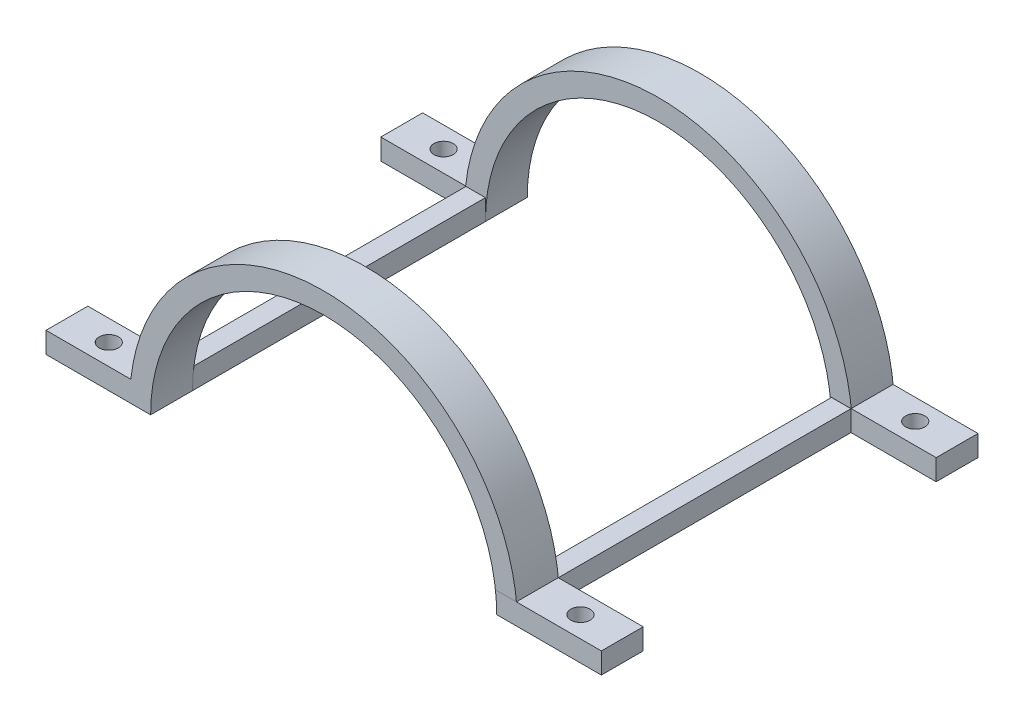
ISO-10303-21;
HEADER;
FILE_DESCRIPTION(('STEP AP214'),'2;1');
FILE_NAME('part.step','',(''),(''),'','','');
FILE_SCHEMA(('AUTOMOTIVE_DESIGN { 1 0 10303 214 1 1 1 1 }'));
ENDSEC;
DATA;
#1=APPLICATION_CONTEXT('core data for automotive mechanical design processes');
#2=APPLICATION_PROTOCOL_DEFINITION('international standard','automotive_design',2000,#1);
#3=PRODUCT_CONTEXT('',#1,'mechanical');
#4=PRODUCT('Part','Part','',(#3));
#5=PRODUCT_RELATED_PRODUCT_CATEGORY('part','',(#4));
#6=PRODUCT_DEFINITION_FORMATION('','',#4);
#7=PRODUCT_DEFINITION_CONTEXT('part definition',#1,'design');
#8=PRODUCT_DEFINITION('design','',#6,#7);
#9=PRODUCT_DEFINITION_SHAPE('','',#8);
#10=(LENGTH_UNIT() NAMED_UNIT(*) SI_UNIT(.MILLI.,.METRE.));
#11=(NAMED_UNIT(*) PLANE_ANGLE_UNIT() SI_UNIT($,.RADIAN.));
#12=(NAMED_UNIT(*) SI_UNIT($,.STERADIAN.) SOLID_ANGLE_UNIT());
#13=UNCERTAINTY_MEASURE_WITH_UNIT(LENGTH_MEASURE(1.E-05),#10,'distance_accuracy_value','');
#14=(GEOMETRIC_REPRESENTATION_CONTEXT(3) GLOBAL_UNCERTAINTY_ASSIGNED_CONTEXT((#13)) GLOBAL_UNIT_ASSIGNED_CONTEXT((#10,
#11,#12)) REPRESENTATION_CONTEXT('',''));
#15=CARTESIAN_POINT('',(0.,0.,0.));
#16=DIRECTION('',(0.,0.,1.));
#17=DIRECTION('',(1.,0.,0.));
#18=AXIS2_PLACEMENT_3D('',#15,#16,#17);
#19=CARTESIAN_POINT('',(66.35,0.,80.));
#20=DIRECTION('',(-1.,0.,0.));
#21=DIRECTION('',(0.,0.,1.));
#22=AXIS2_PLACEMENT_3D('',#19,#20,#21);
#23=PLANE('',#22);
#24=DIRECTION('',(0.,-1.,0.));
#25=VECTOR('',#24,1.);
#26=CARTESIAN_POINT('',(66.35,0.,90.));
#27=LINE('',#26,#25);
#28=CARTESIAN_POINT('',(66.35,5.,90.));
#29=VERTEX_POINT('',#28);
#30=CARTESIAN_POINT('',(66.35,0.,90.));
#31=VERTEX_POINT('',#30);
#32=EDGE_CURVE('E125',#29,#31,#27,.T.);
#33=ORIENTED_EDGE('',*,*,#32,.T.);
#34=DIRECTION('',(0.,0.,-1.));
#35=VECTOR('',#34,1.);
#36=CARTESIAN_POINT('',(66.35,0.,90.));
#37=LINE('',#36,#35);
#38=CARTESIAN_POINT('',(66.35,0.,80.));
#39=VERTEX_POINT('',#38);
#40=EDGE_CURVE('E116',#31,#39,#37,.T.);
#41=ORIENTED_EDGE('',*,*,#40,.T.);
#42=DIRECTION('',(0.,1.,0.));
#43=VECTOR('',#42,1.);
#44=CARTESIAN_POINT('',(66.35,0.,80.));
#45=LINE('',#44,#43);
#46=CARTESIAN_POINT('',(66.35,5.,80.));
#47=VERTEX_POINT('',#46);
#48=EDGE_CURVE('E129',#39,#47,#45,.T.);
#49=ORIENTED_EDGE('',*,*,#48,.T.);
#50=DIRECTION('',(0.,0.,1.));
#51=VECTOR('',#50,1.);
#52=CARTESIAN_POINT('',(66.35,5.,90.));
#53=LINE('',#52,#51);
#54=EDGE_CURVE('E78',#47,#29,#53,.T.);
#55=ORIENTED_EDGE('',*,*,#54,.T.);
#56=EDGE_LOOP('',(#33,#41,#49,#55));
#57=FACE_BOUND('',#56,.T.);
#58=ADVANCED_FACE('F53',(#57),#23,.F.);
#59=CARTESIAN_POINT('',(66.35,5.,90.));
#60=DIRECTION('',(0.,-1.,0.));
#61=DIRECTION('',(0.,0.,-1.));
#62=AXIS2_PLACEMENT_3D('',#59,#60,#61);
#63=PLANE('',#62);
#64=CARTESIAN_POINT('',(56.35,5.,85.));
#65=DIRECTION('',(0.,-1.,0.));
#66=DIRECTION('',(0.,0.,-1.));
#67=AXIS2_PLACEMENT_3D('',#64,#65,#66);
#68=CIRCLE('',#67,2.3);
#69=CARTESIAN_POINT('',(56.35,5.,82.7));
#70=VERTEX_POINT('',#69);
#71=EDGE_CURVE('E147',#70,#70,#68,.T.);
#72=ORIENTED_EDGE('',*,*,#71,.T.);
#73=EDGE_LOOP('',(#72));
#74=FACE_BOUND('',#73,.T.);
#75=DIRECTION('',(0.,0.,-1.));
#76=VECTOR('',#75,1.);
#77=CARTESIAN_POINT('',(41.0465893832849,5.,130.));
#78=LINE('',#77,#76);
#79=CARTESIAN_POINT('',(41.0465893832849,5.,90.));
#80=VERTEX_POINT('',#79);
#81=CARTESIAN_POINT('',(41.0465893832849,5.,80.));
#82=VERTEX_POINT('',#81);
#83=EDGE_CURVE('E12',#80,#82,#78,.T.);
#84=ORIENTED_EDGE('',*,*,#83,.F.);
#85=DIRECTION('',(-1.,0.,0.));
#86=VECTOR('',#85,1.);
#87=CARTESIAN_POINT('',(66.35,5.,90.));
#88=LINE('',#87,#86);
#89=EDGE_CURVE('E112',#29,#80,#88,.T.);
#90=ORIENTED_EDGE('',*,*,#89,.F.);
#91=ORIENTED_EDGE('',*,*,#54,.F.);
#92=DIRECTION('',(-1.,0.,0.));
#93=VECTOR('',#92,1.);
#94=CARTESIAN_POINT('',(66.35,5.,80.));
#95=LINE('',#94,#93);
#96=EDGE_CURVE('E102',#47,#82,#95,.T.);
#97=ORIENTED_EDGE('',*,*,#96,.T.);
#98=EDGE_LOOP('',(#84,#90,#91,#97));
#99=FACE_BOUND('',#98,.T.);
#100=ADVANCED_FACE('F109',(#74,#99),#63,.F.);
#101=CARTESIAN_POINT('',(66.35,0.,80.));
#102=DIRECTION('',(0.,0.,1.));
#103=DIRECTION('',(1.,0.,0.));
#104=AXIS2_PLACEMENT_3D('',#101,#102,#103);
#105=PLANE('',#104);
#106=CARTESIAN_POINT('',(0.,0.,80.));
#107=DIRECTION('',(0.,0.,1.));
#108=DIRECTION('',(1.,0.,0.));
#109=AXIS2_PLACEMENT_3D('',#106,#107,#108);
#110=CIRCLE('',#109,41.35);
#111=CARTESIAN_POINT('',(41.35,0.,80.));
#112=VERTEX_POINT('',#111);
#113=EDGE_CURVE('E94',#82,#112,#110,.F.);
#114=ORIENTED_EDGE('',*,*,#113,.F.);
#115=ORIENTED_EDGE('',*,*,#96,.F.);
#116=ORIENTED_EDGE('',*,*,#48,.F.);
#117=DIRECTION('',(-1.,0.,0.));
#118=VECTOR('',#117,1.);
#119=CARTESIAN_POINT('',(66.35,0.,80.));
#120=LINE('',#119,#118);
#121=EDGE_CURVE('E106',#39,#112,#120,.T.);
#122=ORIENTED_EDGE('',*,*,#121,.T.);
#123=EDGE_LOOP('',(#114,#115,#116,#122));
#124=FACE_BOUND('',#123,.T.);
#125=ADVANCED_FACE('F105',(#124),#105,.F.);
#126=CARTESIAN_POINT('',(66.35,0.,90.));
#127=DIRECTION('',(0.,1.,0.));
#128=DIRECTION('',(0.,0.,1.));
#129=AXIS2_PLACEMENT_3D('',#126,#127,#128);
#130=PLANE('',#129);
#131=CARTESIAN_POINT('',(56.35,0.,85.));
#132=DIRECTION('',(0.,-1.,0.));
#133=DIRECTION('',(0.,0.,-1.));
#134=AXIS2_PLACEMENT_3D('',#131,#132,#133);
#135=CIRCLE('',#134,2.3);
#136=CARTESIAN_POINT('',(56.35,0.,82.7));
#137=VERTEX_POINT('',#136);
#138=EDGE_CURVE('E107',#137,#137,#135,.T.);
#139=ORIENTED_EDGE('',*,*,#138,.F.);
#140=EDGE_LOOP('',(#139));
#141=FACE_BOUND('',#140,.T.);
#142=DIRECTION('',(0.,0.,-1.));
#143=VECTOR('',#142,1.);
#144=CARTESIAN_POINT('',(41.35,0.,130.));
#145=LINE('',#144,#143);
#146=CARTESIAN_POINT('',(41.35,0.,90.));
#147=VERTEX_POINT('',#146);
#148=EDGE_CURVE('E110',#112,#147,#145,.F.);
#149=ORIENTED_EDGE('',*,*,#148,.F.);
#150=ORIENTED_EDGE('',*,*,#121,.F.);
#151=ORIENTED_EDGE('',*,*,#40,.F.);
#152=DIRECTION('',(-1.,0.,0.));
#153=VECTOR('',#152,1.);
#154=CARTESIAN_POINT('',(66.35,0.,90.));
#155=LINE('',#154,#153);
#156=EDGE_CURVE('E64',#31,#147,#155,.T.);
#157=ORIENTED_EDGE('',*,*,#156,.T.);
#158=EDGE_LOOP('',(#149,#150,#151,#157));
#159=FACE_BOUND('',#158,.T.);
#160=ADVANCED_FACE('F120',(#141,#159),#130,.F.);
#161=CARTESIAN_POINT('',(66.35,0.,90.));
#162=DIRECTION('',(0.,0.,-1.));
#163=DIRECTION('',(-1.,0.,0.));
#164=AXIS2_PLACEMENT_3D('',#161,#162,#163);
#165=PLANE('',#164);
#166=CARTESIAN_POINT('',(0.,0.,90.));
#167=DIRECTION('',(0.,0.,-1.));
#168=DIRECTION('',(-1.,0.,0.));
#169=AXIS2_PLACEMENT_3D('',#166,#167,#168);
#170=CIRCLE('',#169,41.35);
#171=EDGE_CURVE('E70',#147,#80,#170,.F.);
#172=ORIENTED_EDGE('',*,*,#171,.F.);
#173=ORIENTED_EDGE('',*,*,#156,.F.);
#174=ORIENTED_EDGE('',*,*,#32,.F.);
#175=ORIENTED_EDGE('',*,*,#89,.T.);
#176=EDGE_LOOP('',(#172,#173,#174,#175));
#177=FACE_BOUND('',#176,.T.);
#178=ADVANCED_FACE('F57',(#177),#165,.F.);
#179=CARTESIAN_POINT('',(0.,0.,130.));
#180=DIRECTION('',(0.,0.,-1.));
#181=DIRECTION('',(-1.,0.,0.));
#182=AXIS2_PLACEMENT_3D('',#179,#180,#181);
#183=CYLINDRICAL_SURFACE('',#182,41.35);
#184=ORIENTED_EDGE('',*,*,#171,.T.);
#185=ORIENTED_EDGE('',*,*,#83,.T.);
#186=ORIENTED_EDGE('',*,*,#113,.T.);
#187=ORIENTED_EDGE('',*,*,#148,.T.);
#188=EDGE_LOOP('',(#184,#185,#186,#187));
#189=FACE_BOUND('',#188,.T.);
#190=ADVANCED_FACE('F91',(#189),#183,.F.);
#191=CARTESIAN_POINT('',(56.35,-127.7,85.));
#192=DIRECTION('',(0.,1.,0.));
#193=DIRECTION('',(0.,0.,-1.));
#194=AXIS2_PLACEMENT_3D('',#191,#192,#193);
#195=CYLINDRICAL_SURFACE('',#194,2.3);
#196=ORIENTED_EDGE('',*,*,#71,.F.);
#197=EDGE_LOOP('',(#196));
#198=FACE_BOUND('',#197,.T.);
#199=ORIENTED_EDGE('',*,*,#138,.T.);
#200=EDGE_LOOP('',(#199));
#201=FACE_BOUND('',#200,.T.);
#202=ADVANCED_FACE('F156',(#198,#201),#195,.F.);
#203=CLOSED_SHELL('',(#58,#100,#125,#160,#178,#190,#202));
#204=MANIFOLD_SOLID_BREP('B2',#203);
#205=CARTESIAN_POINT('',(66.35,0.,0.));
#206=DIRECTION('',(-1.,0.,0.));
#207=DIRECTION('',(0.,0.,1.));
#208=AXIS2_PLACEMENT_3D('',#205,#206,#207);
#209=PLANE('',#208);
#210=DIRECTION('',(0.,-1.,0.));
#211=VECTOR('',#210,1.);
#212=CARTESIAN_POINT('',(66.35,0.,10.));
#213=LINE('',#212,#211);
#214=CARTESIAN_POINT('',(66.35,5.,10.));
#215=VERTEX_POINT('',#214);
#216=CARTESIAN_POINT('',(66.35,0.,10.));
#217=VERTEX_POINT('',#216);
#218=EDGE_CURVE('E277',#215,#217,#213,.T.);
#219=ORIENTED_EDGE('',*,*,#218,.T.);
#220=DIRECTION('',(0.,0.,-1.));
#221=VECTOR('',#220,1.);
#222=CARTESIAN_POINT('',(66.35,0.,10.));
#223=LINE('',#222,#221);
#224=CARTESIAN_POINT('',(66.35,0.,0.));
#225=VERTEX_POINT('',#224);
#226=EDGE_CURVE('E272',#217,#225,#223,.T.);
#227=ORIENTED_EDGE('',*,*,#226,.T.);
#228=DIRECTION('',(0.,1.,0.));
#229=VECTOR('',#228,1.);
#230=CARTESIAN_POINT('',(66.35,0.,0.));
#231=LINE('',#230,#229);
#232=CARTESIAN_POINT('',(66.35,5.,0.));
#233=VERTEX_POINT('',#232);
#234=EDGE_CURVE('E290',#225,#233,#231,.T.);
#235=ORIENTED_EDGE('',*,*,#234,.T.);
#236=DIRECTION('',(0.,0.,1.));
#237=VECTOR('',#236,1.);
#238=CARTESIAN_POINT('',(66.35,5.,10.));
#239=LINE('',#238,#237);
#240=EDGE_CURVE('E226',#233,#215,#239,.T.);
#241=ORIENTED_EDGE('',*,*,#240,.T.);
#242=EDGE_LOOP('',(#219,#227,#235,#241));
#243=FACE_BOUND('',#242,.T.);
#244=ADVANCED_FACE('F208',(#243),#209,.F.);
#245=CARTESIAN_POINT('',(56.35,-127.7,5.));
#246=DIRECTION('',(0.,1.,0.));
#247=DIRECTION('',(0.,0.,1.));
#248=AXIS2_PLACEMENT_3D('',#245,#246,#247);
#249=CYLINDRICAL_SURFACE('',#248,2.3);
#250=CARTESIAN_POINT('',(56.35,5.,5.));
#251=DIRECTION('',(0.,1.,0.));
#252=DIRECTION('',(0.,0.,1.));
#253=AXIS2_PLACEMENT_3D('',#250,#251,#252);
#254=CIRCLE('',#253,2.3);
#255=CARTESIAN_POINT('',(56.35,5.,7.3));
#256=VERTEX_POINT('',#255);
#257=EDGE_CURVE('E280',#256,#256,#254,.T.);
#258=ORIENTED_EDGE('',*,*,#257,.T.);
#259=EDGE_LOOP('',(#258));
#260=FACE_BOUND('',#259,.T.);
#261=CARTESIAN_POINT('',(56.35,0.,5.));
#262=DIRECTION('',(0.,1.,0.));
#263=DIRECTION('',(0.,0.,1.));
#264=AXIS2_PLACEMENT_3D('',#261,#262,#263);
#265=CIRCLE('',#264,2.3);
#266=CARTESIAN_POINT('',(56.35,0.,7.3));
#267=VERTEX_POINT('',#266);
#268=EDGE_CURVE('E278',#267,#267,#265,.T.);
#269=ORIENTED_EDGE('',*,*,#268,.F.);
#270=EDGE_LOOP('',(#269));
#271=FACE_BOUND('',#270,.T.);
#272=ADVANCED_FACE('F288',(#260,#271),#249,.F.);
#273=CARTESIAN_POINT('',(66.35,5.,10.));
#274=DIRECTION('',(0.,-1.,0.));
#275=DIRECTION('',(0.,0.,-1.));
#276=AXIS2_PLACEMENT_3D('',#273,#274,#275);
#277=PLANE('',#276);
#278=ORIENTED_EDGE('',*,*,#257,.F.);
#279=EDGE_LOOP('',(#278));
#280=FACE_BOUND('',#279,.T.);
#281=DIRECTION('',(0.,0.,-1.));
#282=VECTOR('',#281,1.);
#283=CARTESIAN_POINT('',(41.0465893832849,5.,50.));
#284=LINE('',#283,#282);
#285=CARTESIAN_POINT('',(41.0465893832849,5.,10.));
#286=VERTEX_POINT('',#285);
#287=CARTESIAN_POINT('',(41.0465893832849,5.,0.));
#288=VERTEX_POINT('',#287);
#289=EDGE_CURVE('E55',#286,#288,#284,.T.);
#290=ORIENTED_EDGE('',*,*,#289,.F.);
#291=DIRECTION('',(-1.,0.,0.));
#292=VECTOR('',#291,1.);
#293=CARTESIAN_POINT('',(66.35,5.,10.));
#294=LINE('',#293,#292);
#295=EDGE_CURVE('E262',#215,#286,#294,.T.);
#296=ORIENTED_EDGE('',*,*,#295,.F.);
#297=ORIENTED_EDGE('',*,*,#240,.F.);
#298=DIRECTION('',(-1.,0.,0.));
#299=VECTOR('',#298,1.);
#300=CARTESIAN_POINT('',(66.35,5.,0.));
#301=LINE('',#300,#299);
#302=EDGE_CURVE('E256',#233,#288,#301,.T.);
#303=ORIENTED_EDGE('',*,*,#302,.T.);
#304=EDGE_LOOP('',(#290,#296,#297,#303));
#305=FACE_BOUND('',#304,.T.);
#306=ADVANCED_FACE('F263',(#280,#305),#277,.F.);
#307=CARTESIAN_POINT('',(66.35,0.,0.));
#308=DIRECTION('',(0.,0.,1.));
#309=DIRECTION('',(1.,0.,0.));
#310=AXIS2_PLACEMENT_3D('',#307,#308,#309);
#311=PLANE('',#310);
#312=CARTESIAN_POINT('',(0.,0.,0.));
#313=DIRECTION('',(0.,0.,1.));
#314=DIRECTION('',(1.,0.,0.));
#315=AXIS2_PLACEMENT_3D('',#312,#313,#314);
#316=CIRCLE('',#315,41.35);
#317=CARTESIAN_POINT('',(41.35,0.,0.));
#318=VERTEX_POINT('',#317);
#319=EDGE_CURVE('E250',#288,#318,#316,.F.);
#320=ORIENTED_EDGE('',*,*,#319,.F.);
#321=ORIENTED_EDGE('',*,*,#302,.F.);
#322=ORIENTED_EDGE('',*,*,#234,.F.);
#323=DIRECTION('',(-1.,0.,0.));
#324=VECTOR('',#323,1.);
#325=CARTESIAN_POINT('',(66.35,0.,0.));
#326=LINE('',#325,#324);
#327=EDGE_CURVE('E257',#225,#318,#326,.T.);
#328=ORIENTED_EDGE('',*,*,#327,.T.);
#329=EDGE_LOOP('',(#320,#321,#322,#328));
#330=FACE_BOUND('',#329,.T.);
#331=ADVANCED_FACE('F258',(#330),#311,.F.);
#332=CARTESIAN_POINT('',(66.35,0.,10.));
#333=DIRECTION('',(0.,1.,0.));
#334=DIRECTION('',(0.,0.,1.));
#335=AXIS2_PLACEMENT_3D('',#332,#333,#334);
#336=PLANE('',#335);
#337=ORIENTED_EDGE('',*,*,#268,.T.);
#338=EDGE_LOOP('',(#337));
#339=FACE_BOUND('',#338,.T.);
#340=DIRECTION('',(0.,0.,-1.));
#341=VECTOR('',#340,1.);
#342=CARTESIAN_POINT('',(41.35,0.,50.));
#343=LINE('',#342,#341);
#344=CARTESIAN_POINT('',(41.35,0.,9.99999999999999));
#345=VERTEX_POINT('',#344);
#346=EDGE_CURVE('E261',#318,#345,#343,.F.);
#347=ORIENTED_EDGE('',*,*,#346,.F.);
#348=ORIENTED_EDGE('',*,*,#327,.F.);
#349=ORIENTED_EDGE('',*,*,#226,.F.);
#350=DIRECTION('',(-1.,0.,0.));
#351=VECTOR('',#350,1.);
#352=CARTESIAN_POINT('',(66.35,0.,10.));
#353=LINE('',#352,#351);
#354=EDGE_CURVE('E216',#217,#345,#353,.T.);
#355=ORIENTED_EDGE('',*,*,#354,.T.);
#356=EDGE_LOOP('',(#347,#348,#349,#355));
#357=FACE_BOUND('',#356,.T.);
#358=ADVANCED_FACE('F275',(#339,#357),#336,.F.);
#359=CARTESIAN_POINT('',(66.35,0.,10.));
#360=DIRECTION('',(0.,0.,-1.));
#361=DIRECTION('',(-1.,0.,0.));
#362=AXIS2_PLACEMENT_3D('',#359,#360,#361);
#363=PLANE('',#362);
#364=CARTESIAN_POINT('',(0.,0.,10.));
#365=DIRECTION('',(0.,0.,-1.));
#366=DIRECTION('',(-1.,0.,0.));
#367=AXIS2_PLACEMENT_3D('',#364,#365,#366);
#368=CIRCLE('',#367,41.35);
#369=EDGE_CURVE('E225',#345,#286,#368,.F.);
#370=ORIENTED_EDGE('',*,*,#369,.F.);
#371=ORIENTED_EDGE('',*,*,#354,.F.);
#372=ORIENTED_EDGE('',*,*,#218,.F.);
#373=ORIENTED_EDGE('',*,*,#295,.T.);
#374=EDGE_LOOP('',(#370,#371,#372,#373));
#375=FACE_BOUND('',#374,.T.);
#376=ADVANCED_FACE('F209',(#375),#363,.F.);
#377=CARTESIAN_POINT('',(0.,0.,50.));
#378=DIRECTION('',(0.,0.,-1.));
#379=DIRECTION('',(-1.,0.,0.));
#380=AXIS2_PLACEMENT_3D('',#377,#378,#379);
#381=CYLINDRICAL_SURFACE('',#380,41.35);
#382=ORIENTED_EDGE('',*,*,#369,.T.);
#383=ORIENTED_EDGE('',*,*,#289,.T.);
#384=ORIENTED_EDGE('',*,*,#319,.T.);
#385=ORIENTED_EDGE('',*,*,#346,.T.);
#386=EDGE_LOOP('',(#382,#383,#384,#385));
#387=FACE_BOUND('',#386,.T.);
#388=ADVANCED_FACE('F249',(#387),#381,.F.);
#389=CLOSED_SHELL('',(#244,#272,#306,#331,#358,#376,#388));
#390=MANIFOLD_SOLID_BREP('B6',#389);
#391=CARTESIAN_POINT('',(0.,0.,90.));
#392=DIRECTION('',(0.,0.,-1.));
#393=DIRECTION('',(-1.,0.,0.));
#394=AXIS2_PLACEMENT_3D('',#391,#392,#393);
#395=CYLINDRICAL_SURFACE('',#394,46.35);
#396=DIRECTION('',(0.,0.,-1.));
#397=VECTOR('',#396,1.);
#398=CARTESIAN_POINT('',(-46.0795236520518,5.,90.));
#399=LINE('',#398,#397);
#400=CARTESIAN_POINT('',(-46.0795236520518,5.,90.));
#401=VERTEX_POINT('',#400);
#402=CARTESIAN_POINT('',(-46.0795236520518,5.,80.));
#403=VERTEX_POINT('',#402);
#404=EDGE_CURVE('E515',#401,#403,#399,.T.);
#405=ORIENTED_EDGE('',*,*,#404,.F.);
#406=CARTESIAN_POINT('',(0.,0.,90.));
#407=DIRECTION('',(0.,0.,1.));
#408=DIRECTION('',(1.,0.,0.));
#409=AXIS2_PLACEMENT_3D('',#406,#407,#408);
#410=CIRCLE('',#409,46.35);
#411=CARTESIAN_POINT('',(46.35,0.,90.));
#412=VERTEX_POINT('',#411);
#413=EDGE_CURVE('E649',#412,#401,#410,.T.);
#414=ORIENTED_EDGE('',*,*,#413,.F.);
#415=DIRECTION('',(0.,0.,-1.));
#416=VECTOR('',#415,1.);
#417=CARTESIAN_POINT('',(46.35,0.,90.));
#418=LINE('',#417,#416);
#419=CARTESIAN_POINT('',(46.35,0.,80.));
#420=VERTEX_POINT('',#419);
#421=EDGE_CURVE('E488',#412,#420,#418,.T.);
#422=ORIENTED_EDGE('',*,*,#421,.T.);
#423=CARTESIAN_POINT('',(0.,0.,80.));
#424=DIRECTION('',(0.,0.,1.));
#425=DIRECTION('',(1.,0.,0.));
#426=AXIS2_PLACEMENT_3D('',#423,#424,#425);
#427=CIRCLE('',#426,46.35);
#428=EDGE_CURVE('E514',#420,#403,#427,.T.);
#429=ORIENTED_EDGE('',*,*,#428,.T.);
#430=EDGE_LOOP('',(#405,#414,#422,#429));
#431=FACE_BOUND('',#430,.T.);
#432=ADVANCED_FACE('F352',(#431),#395,.T.);
#433=CARTESIAN_POINT('',(-45.9984208708414,4.94728132986487,85.));
#434=DIRECTION('',(1.,0.,0.));
#435=DIRECTION('',(0.,0.,-1.));
#436=AXIS2_PLACEMENT_3D('',#433,#434,#435);
#437=PLANE('',#436);
#438=DIRECTION('',(0.,-1.,0.));
#439=VECTOR('',#438,1.);
#440=CARTESIAN_POINT('',(-45.9984208708414,4.94728132986487,80.));
#441=LINE('',#440,#439);
#442=CARTESIAN_POINT('',(-45.9984208708414,4.94728132986487,80.));
#443=VERTEX_POINT('',#442);
#444=CARTESIAN_POINT('',(-45.9984208708414,-2.88745506722327E-13,80.));
#445=VERTEX_POINT('',#444);
#446=EDGE_CURVE('E533',#443,#445,#441,.T.);
#447=ORIENTED_EDGE('',*,*,#446,.F.);
#448=DIRECTION('',(0.,0.,-1.));
#449=VECTOR('',#448,1.);
#450=CARTESIAN_POINT('',(-45.9984208708414,4.94728132986487,85.));
#451=LINE('',#450,#449);
#452=CARTESIAN_POINT('',(-45.9984208708414,4.94728132986487,9.99999999999999));
#453=VERTEX_POINT('',#452);
#454=EDGE_CURVE('E557',#443,#453,#451,.T.);
#455=ORIENTED_EDGE('',*,*,#454,.T.);
#456=DIRECTION('',(0.,1.,0.));
#457=VECTOR('',#456,1.);
#458=CARTESIAN_POINT('',(-45.9984208708414,0.,10.));
#459=LINE('',#458,#457);
#460=CARTESIAN_POINT('',(-45.9984208708414,-2.88745506722327E-13,9.99999999999999));
#461=VERTEX_POINT('',#460);
#462=EDGE_CURVE('E599',#461,#453,#459,.T.);
#463=ORIENTED_EDGE('',*,*,#462,.F.);
#464=DIRECTION('',(0.,0.,-1.));
#465=VECTOR('',#464,1.);
#466=CARTESIAN_POINT('',(-45.9984208708414,-2.88745506722327E-13,85.));
#467=LINE('',#466,#465);
#468=EDGE_CURVE('E561',#445,#461,#467,.T.);
#469=ORIENTED_EDGE('',*,*,#468,.F.);
#470=EDGE_LOOP('',(#447,#455,#463,#469));
#471=FACE_BOUND('',#470,.T.);
#472=ADVANCED_FACE('F617',(#471),#437,.F.);
#473=CARTESIAN_POINT('',(-41.35,4.94728132986487,85.));
#474=DIRECTION('',(-1.,0.,0.));
#475=DIRECTION('',(0.,0.,1.));
#476=AXIS2_PLACEMENT_3D('',#473,#474,#475);
#477=PLANE('',#476);
#478=DIRECTION('',(0.,1.,0.));
#479=VECTOR('',#478,1.);
#480=CARTESIAN_POINT('',(-41.35,4.94728132986487,80.));
#481=LINE('',#480,#479);
#482=CARTESIAN_POINT('',(-41.35,-2.88745506722327E-13,80.));
#483=VERTEX_POINT('',#482);
#484=CARTESIAN_POINT('',(-41.35,4.94728132986487,80.));
#485=VERTEX_POINT('',#484);
#486=EDGE_CURVE('E490',#483,#485,#481,.T.);
#487=ORIENTED_EDGE('',*,*,#486,.F.);
#488=DIRECTION('',(0.,0.,-1.));
#489=VECTOR('',#488,1.);
#490=CARTESIAN_POINT('',(-41.35,-2.88745506722327E-13,85.));
#491=LINE('',#490,#489);
#492=CARTESIAN_POINT('',(-41.35,-2.88745506722327E-13,9.99999999999999));
#493=VERTEX_POINT('',#492);
#494=EDGE_CURVE('E564',#483,#493,#491,.T.);
#495=ORIENTED_EDGE('',*,*,#494,.T.);
#496=DIRECTION('',(0.,-1.,0.));
#497=VECTOR('',#496,1.);
#498=CARTESIAN_POINT('',(-41.35,0.,10.));
#499=LINE('',#498,#497);
#500=CARTESIAN_POINT('',(-41.35,4.94728132986487,10.));
#501=VERTEX_POINT('',#500);
#502=EDGE_CURVE('E600',#501,#493,#499,.T.);
#503=ORIENTED_EDGE('',*,*,#502,.F.);
#504=DIRECTION('',(0.,0.,-1.));
#505=VECTOR('',#504,1.);
#506=CARTESIAN_POINT('',(-41.35,4.94728132986487,85.));
#507=LINE('',#506,#505);
#508=EDGE_CURVE('E556',#485,#501,#507,.T.);
#509=ORIENTED_EDGE('',*,*,#508,.F.);
#510=EDGE_LOOP('',(#487,#495,#503,#509));
#511=FACE_BOUND('',#510,.T.);
#512=ADVANCED_FACE('F608',(#511),#477,.F.);
#513=CARTESIAN_POINT('',(-45.9984208708414,4.94728132986487,85.));
#514=DIRECTION('',(0.,-1.,0.));
#515=DIRECTION('',(0.,0.,-1.));
#516=AXIS2_PLACEMENT_3D('',#513,#514,#515);
#517=PLANE('',#516);
#518=DIRECTION('',(-1.,0.,0.));
#519=VECTOR('',#518,1.);
#520=CARTESIAN_POINT('',(-45.9984208708414,4.94728132986487,80.));
#521=LINE('',#520,#519);
#522=EDGE_CURVE('E363',#485,#443,#521,.T.);
#523=ORIENTED_EDGE('',*,*,#522,.F.);
#524=ORIENTED_EDGE('',*,*,#508,.T.);
#525=DIRECTION('',(1.,0.,0.));
#526=VECTOR('',#525,1.);
#527=CARTESIAN_POINT('',(0.,4.94728132986487,10.));
#528=LINE('',#527,#526);
#529=EDGE_CURVE('E592',#453,#501,#528,.T.);
#530=ORIENTED_EDGE('',*,*,#529,.F.);
#531=ORIENTED_EDGE('',*,*,#454,.F.);
#532=EDGE_LOOP('',(#523,#524,#530,#531));
#533=FACE_BOUND('',#532,.T.);
#534=ADVANCED_FACE('F607',(#533),#517,.F.);
#535=CARTESIAN_POINT('',(0.,0.,10.));
#536=DIRECTION('',(0.,0.,-1.));
#537=DIRECTION('',(-1.,0.,0.));
#538=AXIS2_PLACEMENT_3D('',#535,#536,#537);
#539=CYLINDRICAL_SURFACE('',#538,46.35);
#540=DIRECTION('',(0.,0.,-1.));
#541=VECTOR('',#540,1.);
#542=CARTESIAN_POINT('',(-46.0795236520518,5.,10.));
#543=LINE('',#542,#541);
#544=CARTESIAN_POINT('',(-46.0795236520518,5.,10.));
#545=VERTEX_POINT('',#544);
#546=CARTESIAN_POINT('',(-46.0795236520518,5.,0.));
#547=VERTEX_POINT('',#546);
#548=EDGE_CURVE('E555',#545,#547,#543,.T.);
#549=ORIENTED_EDGE('',*,*,#548,.F.);
#550=CARTESIAN_POINT('',(0.,0.,10.));
#551=DIRECTION('',(0.,0.,1.));
#552=DIRECTION('',(1.,0.,0.));
#553=AXIS2_PLACEMENT_3D('',#550,#551,#552);
#554=CIRCLE('',#553,46.35);
#555=CARTESIAN_POINT('',(46.35,0.,10.));
#556=VERTEX_POINT('',#555);
#557=EDGE_CURVE('E574',#556,#545,#554,.T.);
#558=ORIENTED_EDGE('',*,*,#557,.F.);
#559=DIRECTION('',(0.,0.,-1.));
#560=VECTOR('',#559,1.);
#561=CARTESIAN_POINT('',(46.35,0.,10.));
#562=LINE('',#561,#560);
#563=CARTESIAN_POINT('',(46.35,0.,0.));
#564=VERTEX_POINT('',#563);
#565=EDGE_CURVE('E589',#556,#564,#562,.T.);
#566=ORIENTED_EDGE('',*,*,#565,.T.);
#567=CARTESIAN_POINT('',(0.,0.,0.));
#568=DIRECTION('',(0.,0.,1.));
#569=DIRECTION('',(1.,0.,0.));
#570=AXIS2_PLACEMENT_3D('',#567,#568,#569);
#571=CIRCLE('',#570,46.35);
#572=EDGE_CURVE('E581',#564,#547,#571,.T.);
#573=ORIENTED_EDGE('',*,*,#572,.T.);
#574=EDGE_LOOP('',(#549,#558,#566,#573));
#575=FACE_BOUND('',#574,.T.);
#576=ADVANCED_FACE('F669',(#575),#539,.T.);
#577=CARTESIAN_POINT('',(0.,0.,10.));
#578=DIRECTION('',(0.,0.,1.));
#579=DIRECTION('',(1.,0.,0.));
#580=AXIS2_PLACEMENT_3D('',#577,#578,#579);
#581=PLANE('',#580);
#582=DIRECTION('',(0.,1.,0.));
#583=VECTOR('',#582,1.);
#584=CARTESIAN_POINT('',(45.9984208708414,0.,10.));
#585=LINE('',#584,#583);
#586=CARTESIAN_POINT('',(45.9984208708414,-2.88745506722327E-13,9.99999999999999));
#587=VERTEX_POINT('',#586);
#588=CARTESIAN_POINT('',(45.9984208708414,4.94728132986487,10.));
#589=VERTEX_POINT('',#588);
#590=EDGE_CURVE('E673',#587,#589,#585,.T.);
#591=ORIENTED_EDGE('',*,*,#590,.F.);
#592=DIRECTION('',(1.,0.,0.));
#593=VECTOR('',#592,1.);
#594=CARTESIAN_POINT('',(41.35,0.,10.));
#595=LINE('',#594,#593);
#596=EDGE_CURVE('E569',#587,#556,#595,.T.);
#597=ORIENTED_EDGE('',*,*,#596,.T.);
#598=ORIENTED_EDGE('',*,*,#557,.T.);
#599=DIRECTION('',(-1.,0.,0.));
#600=VECTOR('',#599,1.);
#601=CARTESIAN_POINT('',(66.35,5.,10.));
#602=LINE('',#601,#600);
#603=CARTESIAN_POINT('',(-66.35,5.,10.));
#604=VERTEX_POINT('',#603);
#605=EDGE_CURVE('E538',#545,#604,#602,.T.);
#606=ORIENTED_EDGE('',*,*,#605,.T.);
#607=DIRECTION('',(0.,-1.,0.));
#608=VECTOR('',#607,1.);
#609=CARTESIAN_POINT('',(-66.35,0.,10.));
#610=LINE('',#609,#608);
#611=CARTESIAN_POINT('',(-66.35,0.,10.));
#612=VERTEX_POINT('',#611);
#613=EDGE_CURVE('E546',#604,#612,#610,.T.);
#614=ORIENTED_EDGE('',*,*,#613,.T.);
#615=DIRECTION('',(1.,0.,0.));
#616=VECTOR('',#615,1.);
#617=CARTESIAN_POINT('',(-46.35,0.,10.));
#618=LINE('',#617,#616);
#619=EDGE_CURVE('E571',#612,#461,#618,.T.);
#620=ORIENTED_EDGE('',*,*,#619,.T.);
#621=ORIENTED_EDGE('',*,*,#462,.T.);
#622=ORIENTED_EDGE('',*,*,#529,.T.);
#623=ORIENTED_EDGE('',*,*,#502,.T.);
#624=CARTESIAN_POINT('',(0.,0.,10.));
#625=DIRECTION('',(0.,0.,-1.));
#626=DIRECTION('',(1.,0.,0.));
#627=AXIS2_PLACEMENT_3D('',#624,#625,#626);
#628=CIRCLE('',#627,41.35);
#629=CARTESIAN_POINT('',(41.35,0.,10.));
#630=VERTEX_POINT('',#629);
#631=EDGE_CURVE('E570',#493,#630,#628,.T.);
#632=ORIENTED_EDGE('',*,*,#631,.T.);
#633=DIRECTION('',(0.,-1.,0.));
#634=VECTOR('',#633,1.);
#635=CARTESIAN_POINT('',(41.35,0.,10.));
#636=LINE('',#635,#634);
#637=CARTESIAN_POINT('',(41.35,4.94728132986487,10.));
#638=VERTEX_POINT('',#637);
#639=EDGE_CURVE('E373',#638,#630,#636,.T.);
#640=ORIENTED_EDGE('',*,*,#639,.F.);
#641=DIRECTION('',(-1.,0.,0.));
#642=VECTOR('',#641,1.);
#643=CARTESIAN_POINT('',(0.,4.94728132986487,10.));
#644=LINE('',#643,#642);
#645=EDGE_CURVE('E366',#589,#638,#644,.T.);
#646=ORIENTED_EDGE('',*,*,#645,.F.);
#647=EDGE_LOOP('',(#591,#597,#598,#606,#614,#620,#621,#622,#623,#632,#640,#646));
#648=FACE_BOUND('',#647,.T.);
#649=ADVANCED_FACE('F612',(#648),#581,.T.);
#650=CARTESIAN_POINT('',(0.,0.,10.));
#651=DIRECTION('',(0.,0.,-1.));
#652=DIRECTION('',(-1.,0.,0.));
#653=AXIS2_PLACEMENT_3D('',#650,#651,#652);
#654=CYLINDRICAL_SURFACE('',#653,41.35);
#655=CARTESIAN_POINT('',(0.,0.,0.));
#656=DIRECTION('',(0.,0.,-1.));
#657=DIRECTION('',(1.,0.,0.));
#658=AXIS2_PLACEMENT_3D('',#655,#656,#657);
#659=CIRCLE('',#658,41.35);
#660=CARTESIAN_POINT('',(-41.35,0.,0.));
#661=VERTEX_POINT('',#660);
#662=CARTESIAN_POINT('',(41.35,0.,0.));
#663=VERTEX_POINT('',#662);
#664=EDGE_CURVE('E567',#661,#663,#659,.T.);
#665=ORIENTED_EDGE('',*,*,#664,.T.);
#666=DIRECTION('',(0.,0.,-1.));
#667=VECTOR('',#666,1.);
#668=CARTESIAN_POINT('',(41.35,0.,10.));
#669=LINE('',#668,#667);
#670=EDGE_CURVE('E595',#630,#663,#669,.T.);
#671=ORIENTED_EDGE('',*,*,#670,.F.);
#672=ORIENTED_EDGE('',*,*,#631,.F.);
#673=DIRECTION('',(0.,0.,-1.));
#674=VECTOR('',#673,1.);
#675=CARTESIAN_POINT('',(-41.35,0.,10.));
#676=LINE('',#675,#674);
#677=EDGE_CURVE('E580',#493,#661,#676,.T.);
#678=ORIENTED_EDGE('',*,*,#677,.T.);
#679=EDGE_LOOP('',(#665,#671,#672,#678));
#680=FACE_BOUND('',#679,.T.);
#681=ADVANCED_FACE('F351',(#680),#654,.F.);
#682=CARTESIAN_POINT('',(41.35,0.,10.));
#683=DIRECTION('',(0.,1.,0.));
#684=DIRECTION('',(0.,0.,1.));
#685=AXIS2_PLACEMENT_3D('',#682,#683,#684);
#686=PLANE('',#685);
#687=ORIENTED_EDGE('',*,*,#596,.F.);
#688=DIRECTION('',(0.,0.,-1.));
#689=VECTOR('',#688,1.);
#690=CARTESIAN_POINT('',(45.9984208708414,-2.88745506722327E-13,85.));
#691=LINE('',#690,#689);
#692=CARTESIAN_POINT('',(45.9984208708414,0.,80.));
#693=VERTEX_POINT('',#692);
#694=EDGE_CURVE('E500',#693,#587,#691,.T.);
#695=ORIENTED_EDGE('',*,*,#694,.F.);
#696=DIRECTION('',(1.,0.,0.));
#697=VECTOR('',#696,1.);
#698=CARTESIAN_POINT('',(41.35,0.,80.));
#699=LINE('',#698,#697);
#700=EDGE_CURVE('E512',#693,#420,#699,.T.);
#701=ORIENTED_EDGE('',*,*,#700,.T.);
#702=ORIENTED_EDGE('',*,*,#421,.F.);
#703=DIRECTION('',(1.,0.,0.));
#704=VECTOR('',#703,1.);
#705=CARTESIAN_POINT('',(41.35,0.,90.));
#706=LINE('',#705,#704);
#707=CARTESIAN_POINT('',(41.35,0.,90.));
#708=VERTEX_POINT('',#707);
#709=EDGE_CURVE('E483',#708,#412,#706,.T.);
#710=ORIENTED_EDGE('',*,*,#709,.F.);
#711=DIRECTION('',(0.,0.,-1.));
#712=VECTOR('',#711,1.);
#713=CARTESIAN_POINT('',(41.35,0.,90.));
#714=LINE('',#713,#712);
#715=CARTESIAN_POINT('',(41.35,-2.88745506722327E-13,80.));
#716=VERTEX_POINT('',#715);
#717=EDGE_CURVE('E476',#708,#716,#714,.T.);
#718=ORIENTED_EDGE('',*,*,#717,.T.);
#719=DIRECTION('',(0.,0.,-1.));
#720=VECTOR('',#719,1.);
#721=CARTESIAN_POINT('',(41.35,-2.88745506722327E-13,85.));
#722=LINE('',#721,#720);
#723=EDGE_CURVE('E481',#716,#630,#722,.T.);
#724=ORIENTED_EDGE('',*,*,#723,.T.);
#725=ORIENTED_EDGE('',*,*,#670,.T.);
#726=DIRECTION('',(1.,0.,0.));
#727=VECTOR('',#726,1.);
#728=CARTESIAN_POINT('',(41.35,0.,0.));
#729=LINE('',#728,#727);
#730=EDGE_CURVE('E583',#663,#564,#729,.T.);
#731=ORIENTED_EDGE('',*,*,#730,.T.);
#732=ORIENTED_EDGE('',*,*,#565,.F.);
#733=EDGE_LOOP('',(#687,#695,#701,#702,#710,#718,#724,#725,#731,#732));
#734=FACE_BOUND('',#733,.T.);
#735=ADVANCED_FACE('F477',(#734),#686,.F.);
#736=CARTESIAN_POINT('',(-46.35,0.,10.));
#737=DIRECTION('',(0.,1.,0.));
#738=DIRECTION('',(0.,0.,1.));
#739=AXIS2_PLACEMENT_3D('',#736,#737,#738);
#740=PLANE('',#739);
#741=DIRECTION('',(1.,0.,0.));
#742=VECTOR('',#741,1.);
#743=CARTESIAN_POINT('',(-46.35,0.,80.));
#744=LINE('',#743,#742);
#745=CARTESIAN_POINT('',(-66.35,0.,80.));
#746=VERTEX_POINT('',#745);
#747=EDGE_CURVE('E521',#746,#445,#744,.T.);
#748=ORIENTED_EDGE('',*,*,#747,.T.);
#749=ORIENTED_EDGE('',*,*,#468,.T.);
#750=ORIENTED_EDGE('',*,*,#619,.F.);
#751=DIRECTION('',(0.,0.,-1.));
#752=VECTOR('',#751,1.);
#753=CARTESIAN_POINT('',(-66.35,0.,10.));
#754=LINE('',#753,#752);
#755=CARTESIAN_POINT('',(-66.35,0.,0.));
#756=VERTEX_POINT('',#755);
#757=EDGE_CURVE('E534',#612,#756,#754,.T.);
#758=ORIENTED_EDGE('',*,*,#757,.T.);
#759=DIRECTION('',(1.,0.,0.));
#760=VECTOR('',#759,1.);
#761=CARTESIAN_POINT('',(-46.35,0.,0.));
#762=LINE('',#761,#760);
#763=EDGE_CURVE('E568',#756,#661,#762,.T.);
#764=ORIENTED_EDGE('',*,*,#763,.T.);
#765=ORIENTED_EDGE('',*,*,#677,.F.);
#766=ORIENTED_EDGE('',*,*,#494,.F.);
#767=CARTESIAN_POINT('',(-41.35,0.,90.));
#768=VERTEX_POINT('',#767);
#769=EDGE_CURVE('E508',#768,#483,#491,.T.);
#770=ORIENTED_EDGE('',*,*,#769,.F.);
#771=DIRECTION('',(1.,0.,0.));
#772=VECTOR('',#771,1.);
#773=CARTESIAN_POINT('',(-46.35,0.,90.));
#774=LINE('',#773,#772);
#775=CARTESIAN_POINT('',(-66.35,0.,90.));
#776=VERTEX_POINT('',#775);
#777=EDGE_CURVE('E520',#776,#768,#774,.T.);
#778=ORIENTED_EDGE('',*,*,#777,.F.);
#779=DIRECTION('',(0.,0.,-1.));
#780=VECTOR('',#779,1.);
#781=CARTESIAN_POINT('',(-66.35,0.,90.));
#782=LINE('',#781,#780);
#783=EDGE_CURVE('E621',#776,#746,#782,.T.);
#784=ORIENTED_EDGE('',*,*,#783,.T.);
#785=EDGE_LOOP('',(#748,#749,#750,#758,#764,#765,#766,#770,#778,#784));
#786=FACE_BOUND('',#785,.T.);
#787=CARTESIAN_POINT('',(-56.35,0.,85.));
#788=DIRECTION('',(0.,-1.,0.));
#789=DIRECTION('',(0.,0.,-1.));
#790=AXIS2_PLACEMENT_3D('',#787,#788,#789);
#791=CIRCLE('',#790,2.3);
#792=CARTESIAN_POINT('',(-56.35,0.,82.7));
#793=VERTEX_POINT('',#792);
#794=EDGE_CURVE('E644',#793,#793,#791,.F.);
#795=ORIENTED_EDGE('',*,*,#794,.T.);
#796=EDGE_LOOP('',(#795));
#797=FACE_BOUND('',#796,.T.);
#798=CARTESIAN_POINT('',(-56.35,0.,5.));
#799=DIRECTION('',(0.,1.,0.));
#800=DIRECTION('',(0.,0.,1.));
#801=AXIS2_PLACEMENT_3D('',#798,#799,#800);
#802=CIRCLE('',#801,2.3);
#803=CARTESIAN_POINT('',(-56.35,0.,7.3));
#804=VERTEX_POINT('',#803);
#805=EDGE_CURVE('E548',#804,#804,#802,.F.);
#806=ORIENTED_EDGE('',*,*,#805,.F.);
#807=EDGE_LOOP('',(#806));
#808=FACE_BOUND('',#807,.T.);
#809=ADVANCED_FACE('F620',(#786,#797,#808),#740,.F.);
#810=CARTESIAN_POINT('',(0.,0.,0.));
#811=DIRECTION('',(0.,0.,1.));
#812=DIRECTION('',(1.,0.,0.));
#813=AXIS2_PLACEMENT_3D('',#810,#811,#812);
#814=PLANE('',#813);
#815=ORIENTED_EDGE('',*,*,#763,.F.);
#816=DIRECTION('',(0.,1.,0.));
#817=VECTOR('',#816,1.);
#818=CARTESIAN_POINT('',(-66.35,0.,0.));
#819=LINE('',#818,#817);
#820=CARTESIAN_POINT('',(-66.35,5.,0.));
#821=VERTEX_POINT('',#820);
#822=EDGE_CURVE('E539',#756,#821,#819,.T.);
#823=ORIENTED_EDGE('',*,*,#822,.T.);
#824=DIRECTION('',(-1.,0.,0.));
#825=VECTOR('',#824,1.);
#826=CARTESIAN_POINT('',(66.35,5.,0.));
#827=LINE('',#826,#825);
#828=EDGE_CURVE('E537',#547,#821,#827,.T.);
#829=ORIENTED_EDGE('',*,*,#828,.F.);
#830=ORIENTED_EDGE('',*,*,#572,.F.);
#831=ORIENTED_EDGE('',*,*,#730,.F.);
#832=ORIENTED_EDGE('',*,*,#664,.F.);
#833=EDGE_LOOP('',(#815,#823,#829,#830,#831,#832));
#834=FACE_BOUND('',#833,.T.);
#835=ADVANCED_FACE('F670',(#834),#814,.F.);
#836=CARTESIAN_POINT('',(66.35,5.,10.));
#837=DIRECTION('',(0.,-1.,0.));
#838=DIRECTION('',(0.,0.,-1.));
#839=AXIS2_PLACEMENT_3D('',#836,#837,#838);
#840=PLANE('',#839);
#841=CARTESIAN_POINT('',(-56.35,5.,5.));
#842=DIRECTION('',(0.,-1.,0.));
#843=DIRECTION('',(0.,0.,1.));
#844=AXIS2_PLACEMENT_3D('',#841,#842,#843);
#845=CIRCLE('',#844,2.3);
#846=CARTESIAN_POINT('',(-56.35,5.,7.3));
#847=VERTEX_POINT('',#846);
#848=EDGE_CURVE('E543',#847,#847,#845,.T.);
#849=ORIENTED_EDGE('',*,*,#848,.T.);
#850=EDGE_LOOP('',(#849));
#851=FACE_BOUND('',#850,.T.);
#852=ORIENTED_EDGE('',*,*,#605,.F.);
#853=ORIENTED_EDGE('',*,*,#548,.T.);
#854=ORIENTED_EDGE('',*,*,#828,.T.);
#855=DIRECTION('',(0.,0.,1.));
#856=VECTOR('',#855,1.);
#857=CARTESIAN_POINT('',(-66.35,5.,10.));
#858=LINE('',#857,#856);
#859=EDGE_CURVE('E532',#821,#604,#858,.T.);
#860=ORIENTED_EDGE('',*,*,#859,.T.);
#861=EDGE_LOOP('',(#852,#853,#854,#860));
#862=FACE_BOUND('',#861,.T.);
#863=ADVANCED_FACE('F675',(#851,#862),#840,.F.);
#864=CARTESIAN_POINT('',(-66.35,0.,0.));
#865=DIRECTION('',(-1.,0.,0.));
#866=DIRECTION('',(0.,0.,1.));
#867=AXIS2_PLACEMENT_3D('',#864,#865,#866);
#868=PLANE('',#867);
#869=ORIENTED_EDGE('',*,*,#613,.F.);
#870=ORIENTED_EDGE('',*,*,#859,.F.);
#871=ORIENTED_EDGE('',*,*,#822,.F.);
#872=ORIENTED_EDGE('',*,*,#757,.F.);
#873=EDGE_LOOP('',(#869,#870,#871,#872));
#874=FACE_BOUND('',#873,.T.);
#875=ADVANCED_FACE('F707',(#874),#868,.T.);
#876=CARTESIAN_POINT('',(-56.35,-127.7,5.));
#877=DIRECTION('',(0.,1.,0.));
#878=DIRECTION('',(0.,0.,1.));
#879=AXIS2_PLACEMENT_3D('',#876,#877,#878);
#880=CYLINDRICAL_SURFACE('',#879,2.3);
#881=ORIENTED_EDGE('',*,*,#848,.F.);
#882=EDGE_LOOP('',(#881));
#883=FACE_BOUND('',#882,.T.);
#884=ORIENTED_EDGE('',*,*,#805,.T.);
#885=EDGE_LOOP('',(#884));
#886=FACE_BOUND('',#885,.T.);
#887=ADVANCED_FACE('F715',(#883,#886),#880,.F.);
#888=CARTESIAN_POINT('',(0.,0.,80.));
#889=DIRECTION('',(0.,0.,1.));
#890=DIRECTION('',(1.,0.,0.));
#891=AXIS2_PLACEMENT_3D('',#888,#889,#890);
#892=PLANE('',#891);
#893=ORIENTED_EDGE('',*,*,#700,.F.);
#894=DIRECTION('',(0.,1.,0.));
#895=VECTOR('',#894,1.);
#896=CARTESIAN_POINT('',(45.9984208708414,0.,80.));
#897=LINE('',#896,#895);
#898=CARTESIAN_POINT('',(45.9984208708414,4.94728132986487,80.));
#899=VERTEX_POINT('',#898);
#900=EDGE_CURVE('E683',#693,#899,#897,.T.);
#901=ORIENTED_EDGE('',*,*,#900,.T.);
#902=DIRECTION('',(-1.,0.,0.));
#903=VECTOR('',#902,1.);
#904=CARTESIAN_POINT('',(0.,4.94728132986487,80.));
#905=LINE('',#904,#903);
#906=CARTESIAN_POINT('',(41.35,4.94728132986487,80.));
#907=VERTEX_POINT('',#906);
#908=EDGE_CURVE('E206',#899,#907,#905,.T.);
#909=ORIENTED_EDGE('',*,*,#908,.T.);
#910=DIRECTION('',(0.,-1.,0.));
#911=VECTOR('',#910,1.);
#912=CARTESIAN_POINT('',(41.35,0.,80.));
#913=LINE('',#912,#911);
#914=EDGE_CURVE('E493',#907,#716,#913,.T.);
#915=ORIENTED_EDGE('',*,*,#914,.T.);
#916=CARTESIAN_POINT('',(0.,0.,80.));
#917=DIRECTION('',(0.,0.,-1.));
#918=DIRECTION('',(1.,0.,0.));
#919=AXIS2_PLACEMENT_3D('',#916,#917,#918);
#920=CIRCLE('',#919,41.35);
#921=EDGE_CURVE('E505',#483,#716,#920,.T.);
#922=ORIENTED_EDGE('',*,*,#921,.F.);
#923=ORIENTED_EDGE('',*,*,#486,.T.);
#924=ORIENTED_EDGE('',*,*,#522,.T.);
#925=ORIENTED_EDGE('',*,*,#446,.T.);
#926=ORIENTED_EDGE('',*,*,#747,.F.);
#927=DIRECTION('',(0.,1.,0.));
#928=VECTOR('',#927,1.);
#929=CARTESIAN_POINT('',(-66.35,0.,80.));
#930=LINE('',#929,#928);
#931=CARTESIAN_POINT('',(-66.35,5.,80.));
#932=VERTEX_POINT('',#931);
#933=EDGE_CURVE('E629',#746,#932,#930,.T.);
#934=ORIENTED_EDGE('',*,*,#933,.T.);
#935=DIRECTION('',(-1.,0.,0.));
#936=VECTOR('',#935,1.);
#937=CARTESIAN_POINT('',(66.35,5.,80.));
#938=LINE('',#937,#936);
#939=EDGE_CURVE('E626',#403,#932,#938,.T.);
#940=ORIENTED_EDGE('',*,*,#939,.F.);
#941=ORIENTED_EDGE('',*,*,#428,.F.);
#942=EDGE_LOOP('',(#893,#901,#909,#915,#922,#923,#924,#925,#926,#934,#940,#941));
#943=FACE_BOUND('',#942,.T.);
#944=ADVANCED_FACE('F504',(#943),#892,.F.);
#945=CARTESIAN_POINT('',(0.,0.,90.));
#946=DIRECTION('',(0.,0.,-1.));
#947=DIRECTION('',(-1.,0.,0.));
#948=AXIS2_PLACEMENT_3D('',#945,#946,#947);
#949=CYLINDRICAL_SURFACE('',#948,41.35);
#950=ORIENTED_EDGE('',*,*,#921,.T.);
#951=ORIENTED_EDGE('',*,*,#717,.F.);
#952=CARTESIAN_POINT('',(0.,0.,90.));
#953=DIRECTION('',(0.,0.,-1.));
#954=DIRECTION('',(1.,0.,0.));
#955=AXIS2_PLACEMENT_3D('',#952,#953,#954);
#956=CIRCLE('',#955,41.35);
#957=EDGE_CURVE('E527',#768,#708,#956,.T.);
#958=ORIENTED_EDGE('',*,*,#957,.F.);
#959=ORIENTED_EDGE('',*,*,#769,.T.);
#960=EDGE_LOOP('',(#950,#951,#958,#959));
#961=FACE_BOUND('',#960,.T.);
#962=ADVANCED_FACE('F506',(#961),#949,.F.);
#963=CARTESIAN_POINT('',(0.,0.,90.));
#964=DIRECTION('',(0.,0.,1.));
#965=DIRECTION('',(1.,0.,0.));
#966=AXIS2_PLACEMENT_3D('',#963,#964,#965);
#967=PLANE('',#966);
#968=ORIENTED_EDGE('',*,*,#957,.T.);
#969=ORIENTED_EDGE('',*,*,#709,.T.);
#970=ORIENTED_EDGE('',*,*,#413,.T.);
#971=DIRECTION('',(-1.,0.,0.));
#972=VECTOR('',#971,1.);
#973=CARTESIAN_POINT('',(66.35,5.,90.));
#974=LINE('',#973,#972);
#975=CARTESIAN_POINT('',(-66.35,5.,90.));
#976=VERTEX_POINT('',#975);
#977=EDGE_CURVE('E640',#401,#976,#974,.T.);
#978=ORIENTED_EDGE('',*,*,#977,.T.);
#979=DIRECTION('',(0.,-1.,0.));
#980=VECTOR('',#979,1.);
#981=CARTESIAN_POINT('',(-66.35,0.,90.));
#982=LINE('',#981,#980);
#983=EDGE_CURVE('E518',#976,#776,#982,.T.);
#984=ORIENTED_EDGE('',*,*,#983,.T.);
#985=ORIENTED_EDGE('',*,*,#777,.T.);
#986=EDGE_LOOP('',(#968,#969,#970,#978,#984,#985));
#987=FACE_BOUND('',#986,.T.);
#988=ADVANCED_FACE('F654',(#987),#967,.T.);
#989=CARTESIAN_POINT('',(66.35,5.,90.));
#990=DIRECTION('',(0.,-1.,0.));
#991=DIRECTION('',(0.,0.,-1.));
#992=AXIS2_PLACEMENT_3D('',#989,#990,#991);
#993=PLANE('',#992);
#994=CARTESIAN_POINT('',(-56.35,5.,85.));
#995=DIRECTION('',(0.,1.,0.));
#996=DIRECTION('',(0.,0.,-1.));
#997=AXIS2_PLACEMENT_3D('',#994,#995,#996);
#998=CIRCLE('',#997,2.3);
#999=CARTESIAN_POINT('',(-56.35,5.,82.7));
#1000=VERTEX_POINT('',#999);
#1001=EDGE_CURVE('E893',#1000,#1000,#998,.T.);
#1002=ORIENTED_EDGE('',*,*,#1001,.F.);
#1003=EDGE_LOOP('',(#1002));
#1004=FACE_BOUND('',#1003,.T.);
#1005=ORIENTED_EDGE('',*,*,#977,.F.);
#1006=ORIENTED_EDGE('',*,*,#404,.T.);
#1007=ORIENTED_EDGE('',*,*,#939,.T.);
#1008=DIRECTION('',(0.,0.,1.));
#1009=VECTOR('',#1008,1.);
#1010=CARTESIAN_POINT('',(-66.35,5.,90.));
#1011=LINE('',#1010,#1009);
#1012=EDGE_CURVE('E633',#932,#976,#1011,.T.);
#1013=ORIENTED_EDGE('',*,*,#1012,.T.);
#1014=EDGE_LOOP('',(#1005,#1006,#1007,#1013));
#1015=FACE_BOUND('',#1014,.T.);
#1016=ADVANCED_FACE('F689',(#1004,#1015),#993,.F.);
#1017=CARTESIAN_POINT('',(-66.35,0.,80.));
#1018=DIRECTION('',(-1.,0.,0.));
#1019=DIRECTION('',(0.,0.,1.));
#1020=AXIS2_PLACEMENT_3D('',#1017,#1018,#1019);
#1021=PLANE('',#1020);
#1022=ORIENTED_EDGE('',*,*,#983,.F.);
#1023=ORIENTED_EDGE('',*,*,#1012,.F.);
#1024=ORIENTED_EDGE('',*,*,#933,.F.);
#1025=ORIENTED_EDGE('',*,*,#783,.F.);
#1026=EDGE_LOOP('',(#1022,#1023,#1024,#1025));
#1027=FACE_BOUND('',#1026,.T.);
#1028=ADVANCED_FACE('F638',(#1027),#1021,.T.);
#1029=CARTESIAN_POINT('',(-56.35,-127.7,85.));
#1030=DIRECTION('',(0.,1.,0.));
#1031=DIRECTION('',(0.,0.,-1.));
#1032=AXIS2_PLACEMENT_3D('',#1029,#1030,#1031);
#1033=CYLINDRICAL_SURFACE('',#1032,2.3);
#1034=ORIENTED_EDGE('',*,*,#1001,.T.);
#1035=EDGE_LOOP('',(#1034));
#1036=FACE_BOUND('',#1035,.T.);
#1037=ORIENTED_EDGE('',*,*,#794,.F.);
#1038=EDGE_LOOP('',(#1037));
#1039=FACE_BOUND('',#1038,.T.);
#1040=ADVANCED_FACE('F694',(#1036,#1039),#1033,.F.);
#1041=CARTESIAN_POINT('',(45.9984208708414,4.94728132986487,85.));
#1042=DIRECTION('',(0.,1.,0.));
#1043=DIRECTION('',(0.,0.,1.));
#1044=AXIS2_PLACEMENT_3D('',#1041,#1042,#1043);
#1045=PLANE('',#1044);
#1046=DIRECTION('',(0.,0.,-1.));
#1047=VECTOR('',#1046,1.);
#1048=CARTESIAN_POINT('',(45.9984208708414,4.94728132986487,85.));
#1049=LINE('',#1048,#1047);
#1050=EDGE_CURVE('E507',#899,#589,#1049,.T.);
#1051=ORIENTED_EDGE('',*,*,#1050,.T.);
#1052=ORIENTED_EDGE('',*,*,#645,.T.);
#1053=DIRECTION('',(0.,0.,-1.));
#1054=VECTOR('',#1053,1.);
#1055=CARTESIAN_POINT('',(41.35,4.94728132986487,85.));
#1056=LINE('',#1055,#1054);
#1057=EDGE_CURVE('E497',#907,#638,#1056,.T.);
#1058=ORIENTED_EDGE('',*,*,#1057,.F.);
#1059=ORIENTED_EDGE('',*,*,#908,.F.);
#1060=EDGE_LOOP('',(#1051,#1052,#1058,#1059));
#1061=FACE_BOUND('',#1060,.T.);
#1062=ADVANCED_FACE('F755',(#1061),#1045,.T.);
#1063=CARTESIAN_POINT('',(45.9984208708414,4.94728132986487,85.));
#1064=DIRECTION('',(1.,0.,0.));
#1065=DIRECTION('',(0.,0.,-1.));
#1066=AXIS2_PLACEMENT_3D('',#1063,#1064,#1065);
#1067=PLANE('',#1066);
#1068=ORIENTED_EDGE('',*,*,#694,.T.);
#1069=ORIENTED_EDGE('',*,*,#590,.T.);
#1070=ORIENTED_EDGE('',*,*,#1050,.F.);
#1071=ORIENTED_EDGE('',*,*,#900,.F.);
#1072=EDGE_LOOP('',(#1068,#1069,#1070,#1071));
#1073=FACE_BOUND('',#1072,.T.);
#1074=ADVANCED_FACE('F684',(#1073),#1067,.T.);
#1075=CARTESIAN_POINT('',(41.35,4.94728132986487,85.));
#1076=DIRECTION('',(-1.,0.,0.));
#1077=DIRECTION('',(0.,0.,1.));
#1078=AXIS2_PLACEMENT_3D('',#1075,#1076,#1077);
#1079=PLANE('',#1078);
#1080=ORIENTED_EDGE('',*,*,#1057,.T.);
#1081=ORIENTED_EDGE('',*,*,#639,.T.);
#1082=ORIENTED_EDGE('',*,*,#723,.F.);
#1083=ORIENTED_EDGE('',*,*,#914,.F.);
#1084=EDGE_LOOP('',(#1080,#1081,#1082,#1083));
#1085=FACE_BOUND('',#1084,.T.);
#1086=ADVANCED_FACE('F492',(#1085),#1079,.T.);
#1087=CLOSED_SHELL('',(#432,#472,#512,#534,#576,#649,#681,#735,#809,#835,#863,#875,#887,#944,
#962,#988,#1016,#1028,#1040,#1062,#1074,#1086));
#1088=MANIFOLD_SOLID_BREP('B46',#1087);
#1089=ADVANCED_BREP_SHAPE_REPRESENTATION('',(#18,#204,#390,#1088),#14);
#1090=SHAPE_DEFINITION_REPRESENTATION(#9,#1089);
ENDSEC;
END-ISO-10303-21;
